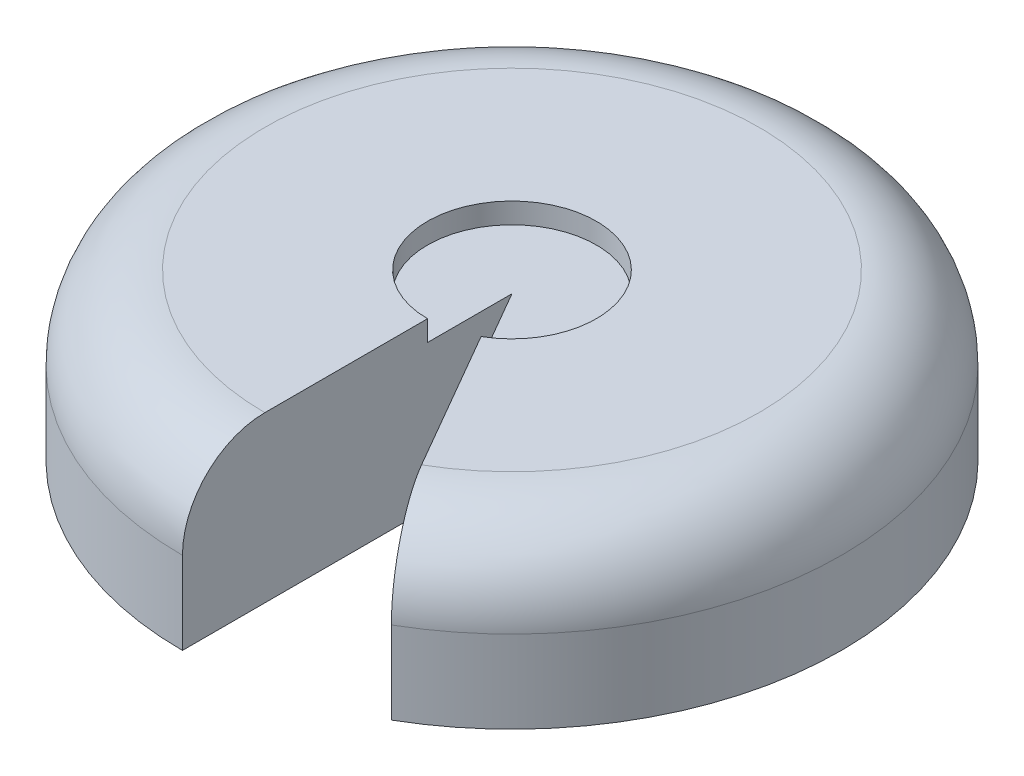
ISO-10303-21;
HEADER;
FILE_DESCRIPTION(('STEP AP214'),'2;1');
FILE_NAME('part.step','',(''),(''),'','','');
FILE_SCHEMA(('AUTOMOTIVE_DESIGN { 1 0 10303 214 1 1 1 1 }'));
ENDSEC;
DATA;
#1=APPLICATION_CONTEXT('core data for automotive mechanical design processes');
#2=APPLICATION_PROTOCOL_DEFINITION('international standard','automotive_design',2000,#1);
#3=PRODUCT_CONTEXT('',#1,'mechanical');
#4=PRODUCT('Part','Part','',(#3));
#5=PRODUCT_RELATED_PRODUCT_CATEGORY('part','',(#4));
#6=PRODUCT_DEFINITION_FORMATION('','',#4);
#7=PRODUCT_DEFINITION_CONTEXT('part definition',#1,'design');
#8=PRODUCT_DEFINITION('design','',#6,#7);
#9=PRODUCT_DEFINITION_SHAPE('','',#8);
#10=(LENGTH_UNIT() NAMED_UNIT(*) SI_UNIT(.MILLI.,.METRE.));
#11=(NAMED_UNIT(*) PLANE_ANGLE_UNIT() SI_UNIT($,.RADIAN.));
#12=(NAMED_UNIT(*) SI_UNIT($,.STERADIAN.) SOLID_ANGLE_UNIT());
#13=UNCERTAINTY_MEASURE_WITH_UNIT(LENGTH_MEASURE(1.E-05),#10,'distance_accuracy_value','');
#14=(GEOMETRIC_REPRESENTATION_CONTEXT(3) GLOBAL_UNCERTAINTY_ASSIGNED_CONTEXT((#13)) GLOBAL_UNIT_ASSIGNED_CONTEXT((#10,
#11,#12)) REPRESENTATION_CONTEXT('',''));
#15=CARTESIAN_POINT('',(0.,0.,0.));
#16=DIRECTION('',(0.,0.,1.));
#17=DIRECTION('',(1.,0.,0.));
#18=AXIS2_PLACEMENT_3D('',#15,#16,#17);
#19=CARTESIAN_POINT('',(0.,20.,0.));
#20=DIRECTION('',(0.866025403784438,0.,-0.500000000000001));
#21=DIRECTION('',(-0.500000000000001,0.,-0.866025403784438));
#22=AXIS2_PLACEMENT_3D('',#19,#20,#21);
#23=PLANE('',#22);
#24=DIRECTION('',(0.,-1.,0.));
#25=VECTOR('',#24,1.);
#26=CARTESIAN_POINT('',(20.0000000000001,20.,34.6410161513775));
#27=LINE('',#26,#25);
#28=CARTESIAN_POINT('',(20.0000000000001,10.,34.6410161513775));
#29=VERTEX_POINT('',#28);
#30=CARTESIAN_POINT('',(20.0000000000001,0.,34.6410161513775));
#31=VERTEX_POINT('',#30);
#32=EDGE_CURVE('E122',#29,#31,#27,.T.);
#33=ORIENTED_EDGE('',*,*,#32,.F.);
#34=CARTESIAN_POINT('',(15.,10.,25.9807621135331));
#35=DIRECTION('',(0.866025403784438,0.,-0.500000000000001));
#36=DIRECTION('',(-0.500000000000001,0.,-0.866025403784438));
#37=AXIS2_PLACEMENT_3D('',#34,#35,#36);
#38=CIRCLE('',#37,10.);
#39=CARTESIAN_POINT('',(15.,20.,25.9807621135331));
#40=VERTEX_POINT('',#39);
#41=EDGE_CURVE('E11',#29,#40,#38,.F.);
#42=ORIENTED_EDGE('',*,*,#41,.T.);
#43=DIRECTION('',(0.500000000000001,0.,0.866025403784438));
#44=VECTOR('',#43,1.);
#45=CARTESIAN_POINT('',(0.,20.,0.));
#46=LINE('',#45,#44);
#47=CARTESIAN_POINT('',(5.12500000000002,20.,8.87676038879049));
#48=VERTEX_POINT('',#47);
#49=EDGE_CURVE('E140',#48,#40,#46,.T.);
#50=ORIENTED_EDGE('',*,*,#49,.F.);
#51=DIRECTION('',(0.,1.,0.));
#52=VECTOR('',#51,1.);
#53=CARTESIAN_POINT('',(5.12500000000002,17.5,8.87676038879049));
#54=LINE('',#53,#52);
#55=CARTESIAN_POINT('',(5.12500000000002,17.5,8.87676038879049));
#56=VERTEX_POINT('',#55);
#57=EDGE_CURVE('E102',#48,#56,#54,.F.);
#58=ORIENTED_EDGE('',*,*,#57,.T.);
#59=DIRECTION('',(0.500000000000001,0.,0.866025403784438));
#60=VECTOR('',#59,1.);
#61=CARTESIAN_POINT('',(0.,17.5,0.));
#62=LINE('',#61,#60);
#63=CARTESIAN_POINT('',(0.,17.5,0.));
#64=VERTEX_POINT('',#63);
#65=EDGE_CURVE('E108',#64,#56,#62,.T.);
#66=ORIENTED_EDGE('',*,*,#65,.F.);
#67=DIRECTION('',(0.,-1.,0.));
#68=VECTOR('',#67,1.);
#69=CARTESIAN_POINT('',(0.,20.,0.));
#70=LINE('',#69,#68);
#71=CARTESIAN_POINT('',(0.,0.,0.));
#72=VERTEX_POINT('',#71);
#73=EDGE_CURVE('E114',#64,#72,#70,.T.);
#74=ORIENTED_EDGE('',*,*,#73,.T.);
#75=DIRECTION('',(0.500000000000001,0.,0.866025403784438));
#76=VECTOR('',#75,1.);
#77=CARTESIAN_POINT('',(0.,0.,0.));
#78=LINE('',#77,#76);
#79=EDGE_CURVE('E145',#72,#31,#78,.T.);
#80=ORIENTED_EDGE('',*,*,#79,.T.);
#81=EDGE_LOOP('',(#33,#42,#50,#58,#66,#74,#80));
#82=FACE_BOUND('',#81,.T.);
#83=ADVANCED_FACE('F40',(#82),#23,.F.);
#84=CARTESIAN_POINT('',(0.,20.,0.));
#85=DIRECTION('',(0.,-1.,0.));
#86=DIRECTION('',(0.,0.,-1.));
#87=AXIS2_PLACEMENT_3D('',#84,#85,#86);
#88=CYLINDRICAL_SURFACE('',#87,40.);
#89=DIRECTION('',(0.,-1.,0.));
#90=VECTOR('',#89,1.);
#91=CARTESIAN_POINT('',(0.,20.,40.));
#92=LINE('',#91,#90);
#93=CARTESIAN_POINT('',(0.,10.,40.));
#94=VERTEX_POINT('',#93);
#95=CARTESIAN_POINT('',(0.,0.,40.));
#96=VERTEX_POINT('',#95);
#97=EDGE_CURVE('E130',#94,#96,#92,.T.);
#98=ORIENTED_EDGE('',*,*,#97,.F.);
#99=CARTESIAN_POINT('',(0.,10.,0.));
#100=DIRECTION('',(0.,1.,0.));
#101=DIRECTION('',(0.,0.,1.));
#102=AXIS2_PLACEMENT_3D('',#99,#100,#101);
#103=CIRCLE('',#102,40.);
#104=EDGE_CURVE('E49',#94,#29,#103,.F.);
#105=ORIENTED_EDGE('',*,*,#104,.T.);
#106=ORIENTED_EDGE('',*,*,#32,.T.);
#107=CARTESIAN_POINT('',(0.,0.,0.));
#108=DIRECTION('',(0.,1.,0.));
#109=DIRECTION('',(0.,0.,1.));
#110=AXIS2_PLACEMENT_3D('',#107,#108,#109);
#111=CIRCLE('',#110,40.);
#112=EDGE_CURVE('E141',#31,#96,#111,.T.);
#113=ORIENTED_EDGE('',*,*,#112,.T.);
#114=EDGE_LOOP('',(#98,#105,#106,#113));
#115=FACE_BOUND('',#114,.T.);
#116=ADVANCED_FACE('F166',(#115),#88,.T.);
#117=CARTESIAN_POINT('',(0.,20.,0.));
#118=DIRECTION('',(1.,0.,0.));
#119=DIRECTION('',(0.,0.,-1.));
#120=AXIS2_PLACEMENT_3D('',#117,#118,#119);
#121=PLANE('',#120);
#122=DIRECTION('',(0.,0.,1.));
#123=VECTOR('',#122,1.);
#124=CARTESIAN_POINT('',(0.,20.,0.));
#125=LINE('',#124,#123);
#126=CARTESIAN_POINT('',(0.,20.,10.25));
#127=VERTEX_POINT('',#126);
#128=CARTESIAN_POINT('',(0.,20.,30.));
#129=VERTEX_POINT('',#128);
#130=EDGE_CURVE('E135',#127,#129,#125,.T.);
#131=ORIENTED_EDGE('',*,*,#130,.T.);
#132=CARTESIAN_POINT('',(0.,10.,30.));
#133=DIRECTION('',(1.,0.,0.));
#134=DIRECTION('',(0.,0.,-1.));
#135=AXIS2_PLACEMENT_3D('',#132,#133,#134);
#136=CIRCLE('',#135,10.);
#137=EDGE_CURVE('E63',#129,#94,#136,.T.);
#138=ORIENTED_EDGE('',*,*,#137,.T.);
#139=ORIENTED_EDGE('',*,*,#97,.T.);
#140=DIRECTION('',(0.,0.,1.));
#141=VECTOR('',#140,1.);
#142=CARTESIAN_POINT('',(0.,0.,0.));
#143=LINE('',#142,#141);
#144=EDGE_CURVE('E136',#72,#96,#143,.T.);
#145=ORIENTED_EDGE('',*,*,#144,.F.);
#146=ORIENTED_EDGE('',*,*,#73,.F.);
#147=DIRECTION('',(0.,0.,1.));
#148=VECTOR('',#147,1.);
#149=CARTESIAN_POINT('',(0.,17.5,0.));
#150=LINE('',#149,#148);
#151=CARTESIAN_POINT('',(0.,17.5,10.25));
#152=VERTEX_POINT('',#151);
#153=EDGE_CURVE('E106',#64,#152,#150,.T.);
#154=ORIENTED_EDGE('',*,*,#153,.T.);
#155=DIRECTION('',(0.,1.,0.));
#156=VECTOR('',#155,1.);
#157=CARTESIAN_POINT('',(0.,17.5,10.25));
#158=LINE('',#157,#156);
#159=EDGE_CURVE('E92',#127,#152,#158,.F.);
#160=ORIENTED_EDGE('',*,*,#159,.F.);
#161=EDGE_LOOP('',(#131,#138,#139,#145,#146,#154,#160));
#162=FACE_BOUND('',#161,.T.);
#163=ADVANCED_FACE('F112',(#162),#121,.T.);
#164=CARTESIAN_POINT('',(0.,20.,0.));
#165=DIRECTION('',(0.,1.,0.));
#166=DIRECTION('',(0.,0.,1.));
#167=AXIS2_PLACEMENT_3D('',#164,#165,#166);
#168=PLANE('',#167);
#169=ORIENTED_EDGE('',*,*,#49,.T.);
#170=CARTESIAN_POINT('',(0.,20.,0.));
#171=DIRECTION('',(0.,1.,0.));
#172=DIRECTION('',(0.,0.,1.));
#173=AXIS2_PLACEMENT_3D('',#170,#171,#172);
#174=CIRCLE('',#173,30.);
#175=EDGE_CURVE('E116',#40,#129,#174,.T.);
#176=ORIENTED_EDGE('',*,*,#175,.T.);
#177=ORIENTED_EDGE('',*,*,#130,.F.);
#178=CARTESIAN_POINT('',(0.,20.,0.));
#179=DIRECTION('',(0.,1.,0.));
#180=DIRECTION('',(0.,0.,1.));
#181=AXIS2_PLACEMENT_3D('',#178,#179,#180);
#182=CIRCLE('',#181,10.25);
#183=EDGE_CURVE('E98',#48,#127,#182,.T.);
#184=ORIENTED_EDGE('',*,*,#183,.F.);
#185=EDGE_LOOP('',(#169,#176,#177,#184));
#186=FACE_BOUND('',#185,.T.);
#187=ADVANCED_FACE('F160',(#186),#168,.T.);
#188=CARTESIAN_POINT('',(0.,0.,0.));
#189=DIRECTION('',(0.,1.,0.));
#190=DIRECTION('',(0.,0.,1.));
#191=AXIS2_PLACEMENT_3D('',#188,#189,#190);
#192=PLANE('',#191);
#193=ORIENTED_EDGE('',*,*,#79,.F.);
#194=ORIENTED_EDGE('',*,*,#144,.T.);
#195=ORIENTED_EDGE('',*,*,#112,.F.);
#196=EDGE_LOOP('',(#193,#194,#195));
#197=FACE_BOUND('',#196,.T.);
#198=ADVANCED_FACE('F168',(#197),#192,.F.);
#199=CARTESIAN_POINT('',(0.,17.5,0.));
#200=DIRECTION('',(0.,1.,0.));
#201=DIRECTION('',(0.,0.,1.));
#202=AXIS2_PLACEMENT_3D('',#199,#200,#201);
#203=PLANE('',#202);
#204=ORIENTED_EDGE('',*,*,#65,.T.);
#205=CARTESIAN_POINT('',(0.,17.5,0.));
#206=DIRECTION('',(0.,1.,0.));
#207=DIRECTION('',(0.,0.,1.));
#208=AXIS2_PLACEMENT_3D('',#205,#206,#207);
#209=CIRCLE('',#208,10.25);
#210=EDGE_CURVE('E95',#56,#152,#209,.T.);
#211=ORIENTED_EDGE('',*,*,#210,.T.);
#212=ORIENTED_EDGE('',*,*,#153,.F.);
#213=EDGE_LOOP('',(#204,#211,#212));
#214=FACE_BOUND('',#213,.T.);
#215=ADVANCED_FACE('F105',(#214),#203,.T.);
#216=CARTESIAN_POINT('',(0.,17.5,0.));
#217=DIRECTION('',(0.,1.,0.));
#218=DIRECTION('',(0.,0.,1.));
#219=AXIS2_PLACEMENT_3D('',#216,#217,#218);
#220=CYLINDRICAL_SURFACE('',#219,10.25);
#221=ORIENTED_EDGE('',*,*,#183,.T.);
#222=ORIENTED_EDGE('',*,*,#159,.T.);
#223=ORIENTED_EDGE('',*,*,#210,.F.);
#224=ORIENTED_EDGE('',*,*,#57,.F.);
#225=EDGE_LOOP('',(#221,#222,#223,#224));
#226=FACE_BOUND('',#225,.T.);
#227=ADVANCED_FACE('F94',(#226),#220,.F.);
#228=CARTESIAN_POINT('',(0.,10.,0.));
#229=DIRECTION('',(0.,1.,0.));
#230=DIRECTION('',(0.,0.,1.));
#231=AXIS2_PLACEMENT_3D('',#228,#229,#230);
#232=TOROIDAL_SURFACE('',#231,30.,10.);
#233=ORIENTED_EDGE('',*,*,#41,.F.);
#234=ORIENTED_EDGE('',*,*,#104,.F.);
#235=ORIENTED_EDGE('',*,*,#137,.F.);
#236=ORIENTED_EDGE('',*,*,#175,.F.);
#237=EDGE_LOOP('',(#233,#234,#235,#236));
#238=FACE_BOUND('',#237,.T.);
#239=ADVANCED_FACE('F42',(#238),#232,.T.);
#240=CLOSED_SHELL('',(#83,#116,#163,#187,#198,#215,#227,#239));
#241=MANIFOLD_SOLID_BREP('B2',#240);
#242=ADVANCED_BREP_SHAPE_REPRESENTATION('',(#18,#241),#14);
#243=SHAPE_DEFINITION_REPRESENTATION(#9,#242);
ENDSEC;
END-ISO-10303-21;
